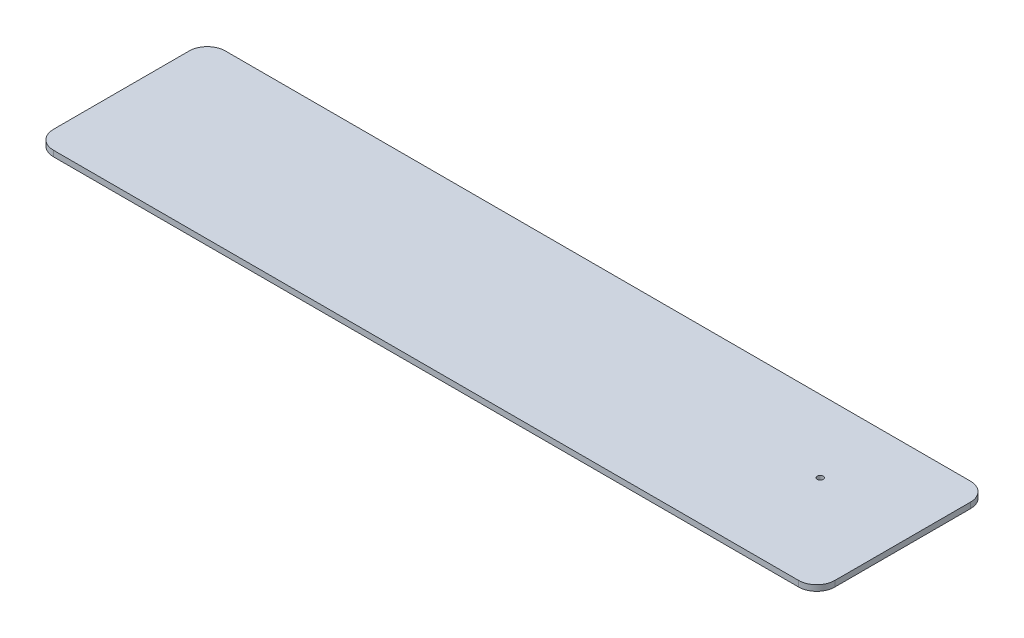
ISO-10303-21;
HEADER;
FILE_DESCRIPTION(('STEP AP214'),'2;1');
FILE_NAME('part.step','',(''),(''),'','','');
FILE_SCHEMA(('AUTOMOTIVE_DESIGN { 1 0 10303 214 1 1 1 1 }'));
ENDSEC;
DATA;
#1=APPLICATION_CONTEXT('core data for automotive mechanical design processes');
#2=APPLICATION_PROTOCOL_DEFINITION('international standard','automotive_design',2000,#1);
#3=PRODUCT_CONTEXT('',#1,'mechanical');
#4=PRODUCT('Part','Part','',(#3));
#5=PRODUCT_RELATED_PRODUCT_CATEGORY('part','',(#4));
#6=PRODUCT_DEFINITION_FORMATION('','',#4);
#7=PRODUCT_DEFINITION_CONTEXT('part definition',#1,'design');
#8=PRODUCT_DEFINITION('design','',#6,#7);
#9=PRODUCT_DEFINITION_SHAPE('','',#8);
#10=(LENGTH_UNIT() NAMED_UNIT(*) SI_UNIT(.MILLI.,.METRE.));
#11=(NAMED_UNIT(*) PLANE_ANGLE_UNIT() SI_UNIT($,.RADIAN.));
#12=(NAMED_UNIT(*) SI_UNIT($,.STERADIAN.) SOLID_ANGLE_UNIT());
#13=UNCERTAINTY_MEASURE_WITH_UNIT(LENGTH_MEASURE(1.E-05),#10,'distance_accuracy_value','');
#14=(GEOMETRIC_REPRESENTATION_CONTEXT(3) GLOBAL_UNCERTAINTY_ASSIGNED_CONTEXT((#13)) GLOBAL_UNIT_ASSIGNED_CONTEXT((#10,
#11,#12)) REPRESENTATION_CONTEXT('',''));
#15=CARTESIAN_POINT('',(0.,0.,0.));
#16=DIRECTION('',(0.,0.,1.));
#17=DIRECTION('',(1.,0.,0.));
#18=AXIS2_PLACEMENT_3D('',#15,#16,#17);
#19=CARTESIAN_POINT('',(0.,3.175,0.));
#20=DIRECTION('',(0.,-1.,0.));
#21=DIRECTION('',(0.,0.,-1.));
#22=AXIS2_PLACEMENT_3D('',#19,#20,#21);
#23=PLANE('',#22);
#24=DIRECTION('',(0.,0.,-1.));
#25=VECTOR('',#24,1.);
#26=CARTESIAN_POINT('',(429.667466266867,3.175,0.));
#27=LINE('',#26,#25);
#28=CARTESIAN_POINT('',(429.667466266867,3.175,-10.));
#29=VERTEX_POINT('',#28);
#30=CARTESIAN_POINT('',(429.667466266867,3.175,-85.));
#31=VERTEX_POINT('',#30);
#32=EDGE_CURVE('E171',#29,#31,#27,.T.);
#33=ORIENTED_EDGE('',*,*,#32,.T.);
#34=CARTESIAN_POINT('',(419.667466266867,3.175,-85.));
#35=DIRECTION('',(0.,-1.,0.));
#36=DIRECTION('',(0.,0.,-1.));
#37=AXIS2_PLACEMENT_3D('',#34,#35,#36);
#38=CIRCLE('',#37,10.);
#39=CARTESIAN_POINT('',(419.667466266867,3.175,-95.));
#40=VERTEX_POINT('',#39);
#41=EDGE_CURVE('E148',#31,#40,#38,.F.);
#42=ORIENTED_EDGE('',*,*,#41,.T.);
#43=DIRECTION('',(-1.,0.,0.));
#44=VECTOR('',#43,1.);
#45=CARTESIAN_POINT('',(-2.13253373313342,3.175,-95.));
#46=LINE('',#45,#44);
#47=CARTESIAN_POINT('',(7.86746626686658,3.175,-95.));
#48=VERTEX_POINT('',#47);
#49=EDGE_CURVE('E119',#40,#48,#46,.T.);
#50=ORIENTED_EDGE('',*,*,#49,.T.);
#51=CARTESIAN_POINT('',(7.86746626686658,3.175,-85.));
#52=DIRECTION('',(0.,-1.,0.));
#53=DIRECTION('',(0.,0.,-1.));
#54=AXIS2_PLACEMENT_3D('',#51,#52,#53);
#55=CIRCLE('',#54,10.);
#56=CARTESIAN_POINT('',(-2.13253373313342,3.175,-85.));
#57=VERTEX_POINT('',#56);
#58=EDGE_CURVE('E143',#48,#57,#55,.F.);
#59=ORIENTED_EDGE('',*,*,#58,.T.);
#60=DIRECTION('',(0.,0.,1.));
#61=VECTOR('',#60,1.);
#62=CARTESIAN_POINT('',(-2.13253373313342,3.175,0.));
#63=LINE('',#62,#61);
#64=CARTESIAN_POINT('',(-2.13253373313342,3.175,-10.));
#65=VERTEX_POINT('',#64);
#66=EDGE_CURVE('E126',#57,#65,#63,.T.);
#67=ORIENTED_EDGE('',*,*,#66,.T.);
#68=CARTESIAN_POINT('',(7.86746626686658,3.175,-10.));
#69=DIRECTION('',(0.,-1.,0.));
#70=DIRECTION('',(0.,0.,-1.));
#71=AXIS2_PLACEMENT_3D('',#68,#69,#70);
#72=CIRCLE('',#71,10.);
#73=CARTESIAN_POINT('',(7.86746626686658,3.175,0.));
#74=VERTEX_POINT('',#73);
#75=EDGE_CURVE('E55',#65,#74,#72,.F.);
#76=ORIENTED_EDGE('',*,*,#75,.T.);
#77=DIRECTION('',(1.,0.,0.));
#78=VECTOR('',#77,1.);
#79=CARTESIAN_POINT('',(-2.13253373313342,3.175,0.));
#80=LINE('',#79,#78);
#81=CARTESIAN_POINT('',(419.667466266867,3.175,0.));
#82=VERTEX_POINT('',#81);
#83=EDGE_CURVE('E129',#74,#82,#80,.T.);
#84=ORIENTED_EDGE('',*,*,#83,.T.);
#85=CARTESIAN_POINT('',(419.667466266867,3.175,-10.));
#86=DIRECTION('',(0.,-1.,0.));
#87=DIRECTION('',(0.,0.,-1.));
#88=AXIS2_PLACEMENT_3D('',#85,#86,#87);
#89=CIRCLE('',#88,10.);
#90=EDGE_CURVE('E146',#82,#29,#89,.F.);
#91=ORIENTED_EDGE('',*,*,#90,.T.);
#92=EDGE_LOOP('',(#33,#42,#50,#59,#67,#76,#84,#91));
#93=FACE_BOUND('',#92,.T.);
#94=CARTESIAN_POINT('',(376.491467746519,3.175,-55.1167208068559));
#95=DIRECTION('',(0.,1.,0.));
#96=DIRECTION('',(0.,0.,1.));
#97=AXIS2_PLACEMENT_3D('',#94,#95,#96);
#98=CIRCLE('',#97,1.64999999999999);
#99=CARTESIAN_POINT('',(376.491467746519,3.175,-53.4667208068559));
#100=VERTEX_POINT('',#99);
#101=EDGE_CURVE('E164',#100,#100,#98,.T.);
#102=ORIENTED_EDGE('',*,*,#101,.F.);
#103=EDGE_LOOP('',(#102));
#104=FACE_BOUND('',#103,.T.);
#105=ADVANCED_FACE('F33',(#93,#104),#23,.F.);
#106=CARTESIAN_POINT('',(0.,0.,0.));
#107=DIRECTION('',(0.,-1.,0.));
#108=DIRECTION('',(0.,0.,-1.));
#109=AXIS2_PLACEMENT_3D('',#106,#107,#108);
#110=PLANE('',#109);
#111=DIRECTION('',(-1.,0.,0.));
#112=VECTOR('',#111,1.);
#113=CARTESIAN_POINT('',(-2.13253373313342,0.,-95.));
#114=LINE('',#113,#112);
#115=CARTESIAN_POINT('',(419.667466266867,0.,-95.));
#116=VERTEX_POINT('',#115);
#117=CARTESIAN_POINT('',(7.86746626686658,0.,-95.));
#118=VERTEX_POINT('',#117);
#119=EDGE_CURVE('E116',#116,#118,#114,.T.);
#120=ORIENTED_EDGE('',*,*,#119,.F.);
#121=CARTESIAN_POINT('',(419.667466266867,0.,-85.));
#122=DIRECTION('',(0.,-1.,0.));
#123=DIRECTION('',(0.,0.,-1.));
#124=AXIS2_PLACEMENT_3D('',#121,#122,#123);
#125=CIRCLE('',#124,10.);
#126=CARTESIAN_POINT('',(429.667466266867,0.,-85.));
#127=VERTEX_POINT('',#126);
#128=EDGE_CURVE('E99',#116,#127,#125,.T.);
#129=ORIENTED_EDGE('',*,*,#128,.T.);
#130=DIRECTION('',(0.,0.,-1.));
#131=VECTOR('',#130,1.);
#132=CARTESIAN_POINT('',(429.667466266867,0.,0.));
#133=LINE('',#132,#131);
#134=CARTESIAN_POINT('',(429.667466266867,0.,-10.));
#135=VERTEX_POINT('',#134);
#136=EDGE_CURVE('E127',#135,#127,#133,.T.);
#137=ORIENTED_EDGE('',*,*,#136,.F.);
#138=CARTESIAN_POINT('',(419.667466266867,0.,-10.));
#139=DIRECTION('',(0.,-1.,0.));
#140=DIRECTION('',(0.,0.,-1.));
#141=AXIS2_PLACEMENT_3D('',#138,#139,#140);
#142=CIRCLE('',#141,10.);
#143=CARTESIAN_POINT('',(419.667466266867,0.,0.));
#144=VERTEX_POINT('',#143);
#145=EDGE_CURVE('E110',#135,#144,#142,.T.);
#146=ORIENTED_EDGE('',*,*,#145,.T.);
#147=DIRECTION('',(1.,0.,0.));
#148=VECTOR('',#147,1.);
#149=CARTESIAN_POINT('',(-2.13253373313342,0.,0.));
#150=LINE('',#149,#148);
#151=CARTESIAN_POINT('',(7.86746626686658,0.,0.));
#152=VERTEX_POINT('',#151);
#153=EDGE_CURVE('E131',#152,#144,#150,.T.);
#154=ORIENTED_EDGE('',*,*,#153,.F.);
#155=CARTESIAN_POINT('',(7.86746626686658,0.,-10.));
#156=DIRECTION('',(0.,-1.,0.));
#157=DIRECTION('',(0.,0.,-1.));
#158=AXIS2_PLACEMENT_3D('',#155,#156,#157);
#159=CIRCLE('',#158,10.);
#160=CARTESIAN_POINT('',(-2.13253373313342,0.,-10.));
#161=VERTEX_POINT('',#160);
#162=EDGE_CURVE('E137',#152,#161,#159,.T.);
#163=ORIENTED_EDGE('',*,*,#162,.T.);
#164=DIRECTION('',(0.,0.,1.));
#165=VECTOR('',#164,1.);
#166=CARTESIAN_POINT('',(-2.13253373313342,0.,0.));
#167=LINE('',#166,#165);
#168=CARTESIAN_POINT('',(-2.13253373313342,0.,-85.));
#169=VERTEX_POINT('',#168);
#170=EDGE_CURVE('E159',#169,#161,#167,.T.);
#171=ORIENTED_EDGE('',*,*,#170,.F.);
#172=CARTESIAN_POINT('',(7.86746626686658,0.,-85.));
#173=DIRECTION('',(0.,-1.,0.));
#174=DIRECTION('',(0.,0.,-1.));
#175=AXIS2_PLACEMENT_3D('',#172,#173,#174);
#176=CIRCLE('',#175,10.);
#177=EDGE_CURVE('E120',#169,#118,#176,.T.);
#178=ORIENTED_EDGE('',*,*,#177,.T.);
#179=EDGE_LOOP('',(#120,#129,#137,#146,#154,#163,#171,#178));
#180=FACE_BOUND('',#179,.T.);
#181=CARTESIAN_POINT('',(376.491467746519,0.,-55.1167208068559));
#182=DIRECTION('',(0.,1.,0.));
#183=DIRECTION('',(0.,0.,1.));
#184=AXIS2_PLACEMENT_3D('',#181,#182,#183);
#185=CIRCLE('',#184,1.64999999999999);
#186=CARTESIAN_POINT('',(376.491467746519,0.,-53.4667208068559));
#187=VERTEX_POINT('',#186);
#188=EDGE_CURVE('E167',#187,#187,#185,.T.);
#189=ORIENTED_EDGE('',*,*,#188,.T.);
#190=EDGE_LOOP('',(#189));
#191=FACE_BOUND('',#190,.T.);
#192=ADVANCED_FACE('F123',(#180,#191),#110,.T.);
#193=CARTESIAN_POINT('',(-2.13253373313342,3.175,0.));
#194=DIRECTION('',(1.,0.,0.));
#195=DIRECTION('',(0.,0.,-1.));
#196=AXIS2_PLACEMENT_3D('',#193,#194,#195);
#197=PLANE('',#196);
#198=ORIENTED_EDGE('',*,*,#170,.T.);
#199=DIRECTION('',(0.,-1.,0.));
#200=VECTOR('',#199,1.);
#201=CARTESIAN_POINT('',(-2.13253373313342,3.175,-10.));
#202=LINE('',#201,#200);
#203=EDGE_CURVE('E11',#161,#65,#202,.F.);
#204=ORIENTED_EDGE('',*,*,#203,.T.);
#205=ORIENTED_EDGE('',*,*,#66,.F.);
#206=DIRECTION('',(0.,-1.,0.));
#207=VECTOR('',#206,1.);
#208=CARTESIAN_POINT('',(-2.13253373313342,3.175,-85.));
#209=LINE('',#208,#207);
#210=EDGE_CURVE('E41',#57,#169,#209,.T.);
#211=ORIENTED_EDGE('',*,*,#210,.T.);
#212=EDGE_LOOP('',(#198,#204,#205,#211));
#213=FACE_BOUND('',#212,.T.);
#214=ADVANCED_FACE('F158',(#213),#197,.F.);
#215=CARTESIAN_POINT('',(-2.13253373313342,3.175,0.));
#216=DIRECTION('',(0.,0.,-1.));
#217=DIRECTION('',(-1.,0.,0.));
#218=AXIS2_PLACEMENT_3D('',#215,#216,#217);
#219=PLANE('',#218);
#220=ORIENTED_EDGE('',*,*,#153,.T.);
#221=DIRECTION('',(0.,-1.,0.));
#222=VECTOR('',#221,1.);
#223=CARTESIAN_POINT('',(419.667466266867,3.175,0.));
#224=LINE('',#223,#222);
#225=EDGE_CURVE('E48',#144,#82,#224,.F.);
#226=ORIENTED_EDGE('',*,*,#225,.T.);
#227=ORIENTED_EDGE('',*,*,#83,.F.);
#228=DIRECTION('',(0.,-1.,0.));
#229=VECTOR('',#228,1.);
#230=CARTESIAN_POINT('',(7.86746626686658,3.175,0.));
#231=LINE('',#230,#229);
#232=EDGE_CURVE('E150',#74,#152,#231,.T.);
#233=ORIENTED_EDGE('',*,*,#232,.T.);
#234=EDGE_LOOP('',(#220,#226,#227,#233));
#235=FACE_BOUND('',#234,.T.);
#236=ADVANCED_FACE('F200',(#235),#219,.F.);
#237=CARTESIAN_POINT('',(429.667466266867,3.175,0.));
#238=DIRECTION('',(-1.,0.,0.));
#239=DIRECTION('',(0.,0.,1.));
#240=AXIS2_PLACEMENT_3D('',#237,#238,#239);
#241=PLANE('',#240);
#242=ORIENTED_EDGE('',*,*,#136,.T.);
#243=DIRECTION('',(0.,-1.,0.));
#244=VECTOR('',#243,1.);
#245=CARTESIAN_POINT('',(429.667466266867,3.175,-85.));
#246=LINE('',#245,#244);
#247=EDGE_CURVE('E104',#127,#31,#246,.F.);
#248=ORIENTED_EDGE('',*,*,#247,.T.);
#249=ORIENTED_EDGE('',*,*,#32,.F.);
#250=DIRECTION('',(0.,-1.,0.));
#251=VECTOR('',#250,1.);
#252=CARTESIAN_POINT('',(429.667466266867,3.175,-10.));
#253=LINE('',#252,#251);
#254=EDGE_CURVE('E109',#29,#135,#253,.T.);
#255=ORIENTED_EDGE('',*,*,#254,.T.);
#256=EDGE_LOOP('',(#242,#248,#249,#255));
#257=FACE_BOUND('',#256,.T.);
#258=ADVANCED_FACE('F188',(#257),#241,.F.);
#259=CARTESIAN_POINT('',(-2.13253373313342,3.175,-95.));
#260=DIRECTION('',(0.,0.,1.));
#261=DIRECTION('',(1.,0.,0.));
#262=AXIS2_PLACEMENT_3D('',#259,#260,#261);
#263=PLANE('',#262);
#264=ORIENTED_EDGE('',*,*,#49,.F.);
#265=DIRECTION('',(0.,-1.,0.));
#266=VECTOR('',#265,1.);
#267=CARTESIAN_POINT('',(419.667466266867,3.175,-95.));
#268=LINE('',#267,#266);
#269=EDGE_CURVE('E103',#40,#116,#268,.T.);
#270=ORIENTED_EDGE('',*,*,#269,.T.);
#271=ORIENTED_EDGE('',*,*,#119,.T.);
#272=DIRECTION('',(0.,-1.,0.));
#273=VECTOR('',#272,1.);
#274=CARTESIAN_POINT('',(7.86746626686658,3.175,-95.));
#275=LINE('',#274,#273);
#276=EDGE_CURVE('E121',#118,#48,#275,.F.);
#277=ORIENTED_EDGE('',*,*,#276,.T.);
#278=EDGE_LOOP('',(#264,#270,#271,#277));
#279=FACE_BOUND('',#278,.T.);
#280=ADVANCED_FACE('F115',(#279),#263,.F.);
#281=CARTESIAN_POINT('',(376.491467746519,3.175,-55.1167208068559));
#282=DIRECTION('',(0.,-1.,0.));
#283=DIRECTION('',(0.,0.,-1.));
#284=AXIS2_PLACEMENT_3D('',#281,#282,#283);
#285=CYLINDRICAL_SURFACE('',#284,1.64999999999999);
#286=ORIENTED_EDGE('',*,*,#101,.T.);
#287=EDGE_LOOP('',(#286));
#288=FACE_BOUND('',#287,.T.);
#289=ORIENTED_EDGE('',*,*,#188,.F.);
#290=EDGE_LOOP('',(#289));
#291=FACE_BOUND('',#290,.T.);
#292=ADVANCED_FACE('F178',(#288,#291),#285,.F.);
#293=CARTESIAN_POINT('',(419.667466266867,3.175,-85.));
#294=DIRECTION('',(0.,-1.,0.));
#295=DIRECTION('',(0.,0.,-1.));
#296=AXIS2_PLACEMENT_3D('',#293,#294,#295);
#297=CYLINDRICAL_SURFACE('',#296,10.);
#298=ORIENTED_EDGE('',*,*,#41,.F.);
#299=ORIENTED_EDGE('',*,*,#247,.F.);
#300=ORIENTED_EDGE('',*,*,#128,.F.);
#301=ORIENTED_EDGE('',*,*,#269,.F.);
#302=EDGE_LOOP('',(#298,#299,#300,#301));
#303=FACE_BOUND('',#302,.T.);
#304=ADVANCED_FACE('F102',(#303),#297,.T.);
#305=CARTESIAN_POINT('',(419.667466266867,3.175,-10.));
#306=DIRECTION('',(0.,-1.,0.));
#307=DIRECTION('',(0.,0.,-1.));
#308=AXIS2_PLACEMENT_3D('',#305,#306,#307);
#309=CYLINDRICAL_SURFACE('',#308,10.);
#310=ORIENTED_EDGE('',*,*,#90,.F.);
#311=ORIENTED_EDGE('',*,*,#225,.F.);
#312=ORIENTED_EDGE('',*,*,#145,.F.);
#313=ORIENTED_EDGE('',*,*,#254,.F.);
#314=EDGE_LOOP('',(#310,#311,#312,#313));
#315=FACE_BOUND('',#314,.T.);
#316=ADVANCED_FACE('F186',(#315),#309,.T.);
#317=CARTESIAN_POINT('',(7.86746626686658,3.175,-10.));
#318=DIRECTION('',(0.,-1.,0.));
#319=DIRECTION('',(0.,0.,-1.));
#320=AXIS2_PLACEMENT_3D('',#317,#318,#319);
#321=CYLINDRICAL_SURFACE('',#320,10.);
#322=ORIENTED_EDGE('',*,*,#75,.F.);
#323=ORIENTED_EDGE('',*,*,#203,.F.);
#324=ORIENTED_EDGE('',*,*,#162,.F.);
#325=ORIENTED_EDGE('',*,*,#232,.F.);
#326=EDGE_LOOP('',(#322,#323,#324,#325));
#327=FACE_BOUND('',#326,.T.);
#328=ADVANCED_FACE('F207',(#327),#321,.T.);
#329=CARTESIAN_POINT('',(7.86746626686658,3.175,-85.));
#330=DIRECTION('',(0.,-1.,0.));
#331=DIRECTION('',(0.,0.,-1.));
#332=AXIS2_PLACEMENT_3D('',#329,#330,#331);
#333=CYLINDRICAL_SURFACE('',#332,10.);
#334=ORIENTED_EDGE('',*,*,#58,.F.);
#335=ORIENTED_EDGE('',*,*,#276,.F.);
#336=ORIENTED_EDGE('',*,*,#177,.F.);
#337=ORIENTED_EDGE('',*,*,#210,.F.);
#338=EDGE_LOOP('',(#334,#335,#336,#337));
#339=FACE_BOUND('',#338,.T.);
#340=ADVANCED_FACE('F35',(#339),#333,.T.);
#341=CLOSED_SHELL('',(#105,#192,#214,#236,#258,#280,#292,#304,#316,#328,#340));
#342=MANIFOLD_SOLID_BREP('B2',#341);
#343=ADVANCED_BREP_SHAPE_REPRESENTATION('',(#18,#342),#14);
#344=SHAPE_DEFINITION_REPRESENTATION(#9,#343);
ENDSEC;
END-ISO-10303-21;
